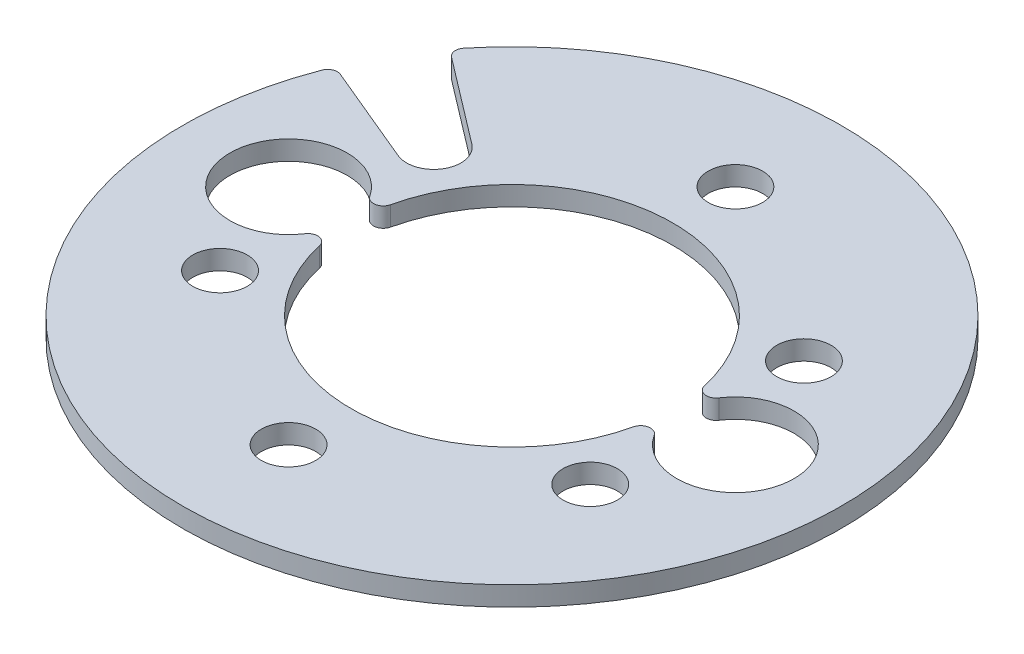
ISO-10303-21;
HEADER;
FILE_DESCRIPTION(('STEP AP214'),'2;1');
FILE_NAME('part.step','',(''),(''),'','','');
FILE_SCHEMA(('AUTOMOTIVE_DESIGN { 1 0 10303 214 1 1 1 1 }'));
ENDSEC;
DATA;
#1=APPLICATION_CONTEXT('core data for automotive mechanical design processes');
#2=APPLICATION_PROTOCOL_DEFINITION('international standard','automotive_design',2000,#1);
#3=PRODUCT_CONTEXT('',#1,'mechanical');
#4=PRODUCT('Part','Part','',(#3));
#5=PRODUCT_RELATED_PRODUCT_CATEGORY('part','',(#4));
#6=PRODUCT_DEFINITION_FORMATION('','',#4);
#7=PRODUCT_DEFINITION_CONTEXT('part definition',#1,'design');
#8=PRODUCT_DEFINITION('design','',#6,#7);
#9=PRODUCT_DEFINITION_SHAPE('','',#8);
#10=(LENGTH_UNIT() NAMED_UNIT(*) SI_UNIT(.MILLI.,.METRE.));
#11=(NAMED_UNIT(*) PLANE_ANGLE_UNIT() SI_UNIT($,.RADIAN.));
#12=(NAMED_UNIT(*) SI_UNIT($,.STERADIAN.) SOLID_ANGLE_UNIT());
#13=UNCERTAINTY_MEASURE_WITH_UNIT(LENGTH_MEASURE(1.E-05),#10,'distance_accuracy_value','');
#14=(GEOMETRIC_REPRESENTATION_CONTEXT(3) GLOBAL_UNCERTAINTY_ASSIGNED_CONTEXT((#13)) GLOBAL_UNIT_ASSIGNED_CONTEXT((#10,
#11,#12)) REPRESENTATION_CONTEXT('',''));
#15=CARTESIAN_POINT('',(0.,0.,0.));
#16=DIRECTION('',(0.,0.,1.));
#17=DIRECTION('',(1.,0.,0.));
#18=AXIS2_PLACEMENT_3D('',#15,#16,#17);
#19=CARTESIAN_POINT('',(-48.806600072886,3.175,-18.683566297026));
#20=DIRECTION('',(0.,-1.,0.));
#21=DIRECTION('',(0.,0.,-1.));
#22=AXIS2_PLACEMENT_3D('',#19,#20,#21);
#23=PLANE('',#22);
#24=CARTESIAN_POINT('',(-30.2459372271715,3.175,17.4625));
#25=DIRECTION('',(0.,1.,0.));
#26=DIRECTION('',(0.,0.,1.));
#27=AXIS2_PLACEMENT_3D('',#24,#25,#26);
#28=CIRCLE('',#27,4.44499999999999);
#29=CARTESIAN_POINT('',(-30.2459372271715,3.175,21.9075));
#30=VERTEX_POINT('',#29);
#31=EDGE_CURVE('E206',#30,#30,#28,.T.);
#32=ORIENTED_EDGE('',*,*,#31,.F.);
#33=EDGE_LOOP('',(#32));
#34=FACE_BOUND('',#33,.T.);
#35=CARTESIAN_POINT('',(30.2459372271715,3.175,-17.4625));
#36=DIRECTION('',(0.,1.,0.));
#37=DIRECTION('',(0.,0.,1.));
#38=AXIS2_PLACEMENT_3D('',#35,#36,#37);
#39=CIRCLE('',#38,4.44499999999999);
#40=CARTESIAN_POINT('',(30.2459372271715,3.175,-13.0175));
#41=VERTEX_POINT('',#40);
#42=EDGE_CURVE('E212',#41,#41,#39,.T.);
#43=ORIENTED_EDGE('',*,*,#42,.F.);
#44=EDGE_LOOP('',(#43));
#45=FACE_BOUND('',#44,.T.);
#46=CARTESIAN_POINT('',(0.,3.175,36.5125));
#47=DIRECTION('',(0.,1.,0.));
#48=DIRECTION('',(0.,0.,1.));
#49=AXIS2_PLACEMENT_3D('',#46,#47,#48);
#50=CIRCLE('',#49,4.445);
#51=CARTESIAN_POINT('',(0.,3.175,40.9575));
#52=VERTEX_POINT('',#51);
#53=EDGE_CURVE('E218',#52,#52,#50,.T.);
#54=ORIENTED_EDGE('',*,*,#53,.F.);
#55=EDGE_LOOP('',(#54));
#56=FACE_BOUND('',#55,.T.);
#57=CARTESIAN_POINT('',(0.,3.175,-36.5125));
#58=DIRECTION('',(0.,1.,0.));
#59=DIRECTION('',(0.,0.,1.));
#60=AXIS2_PLACEMENT_3D('',#57,#58,#59);
#61=CIRCLE('',#60,4.445);
#62=CARTESIAN_POINT('',(0.,3.175,-32.0675));
#63=VERTEX_POINT('',#62);
#64=EDGE_CURVE('E224',#63,#63,#61,.T.);
#65=ORIENTED_EDGE('',*,*,#64,.F.);
#66=EDGE_LOOP('',(#65));
#67=FACE_BOUND('',#66,.T.);
#68=CARTESIAN_POINT('',(-48.806600072886,3.175,-18.683566297026));
#69=DIRECTION('',(0.,1.,0.));
#70=DIRECTION('',(0.,0.,-1.));
#71=AXIS2_PLACEMENT_3D('',#68,#69,#70);
#72=CIRCLE('',#71,1.58749999999999);
#73=CARTESIAN_POINT('',(-48.1942815349155,3.175,-20.148224024298));
#74=VERTEX_POINT('',#73);
#75=CARTESIAN_POINT('',(-50.2891820921109,3.175,-19.2511108382479));
#76=VERTEX_POINT('',#75);
#77=EDGE_CURVE('E230',#74,#76,#72,.T.);
#78=ORIENTED_EDGE('',*,*,#77,.T.);
#79=CARTESIAN_POINT('',(0.,3.175,0.));
#80=DIRECTION('',(0.,1.,0.));
#81=DIRECTION('',(0.,0.,1.));
#82=AXIS2_PLACEMENT_3D('',#79,#80,#81);
#83=CIRCLE('',#82,53.848);
#84=CARTESIAN_POINT('',(-41.8165420830481,3.175,-33.9261538081856));
#85=VERTEX_POINT('',#84);
#86=EDGE_CURVE('E233',#76,#85,#83,.T.);
#87=ORIENTED_EDGE('',*,*,#86,.T.);
#88=CARTESIAN_POINT('',(-40.5837430829583,3.175,-32.9259723869537));
#89=DIRECTION('',(0.,1.,0.));
#90=DIRECTION('',(0.,0.,-1.));
#91=AXIS2_PLACEMENT_3D('',#88,#89,#90);
#92=CIRCLE('',#91,1.58749999999999);
#93=CARTESIAN_POINT('',(-41.5460146136398,3.175,-31.6633601142271));
#94=VERTEX_POINT('',#93);
#95=EDGE_CURVE('E236',#85,#94,#92,.T.);
#96=ORIENTED_EDGE('',*,*,#95,.T.);
#97=DIRECTION('',(0.795346313528562,0.,0.606155294917505));
#98=VECTOR('',#97,1.);
#99=CARTESIAN_POINT('',(-27.5515769412632,3.175,-20.9978143636344));
#100=LINE('',#99,#98);
#101=CARTESIAN_POINT('',(-27.5515769412632,3.175,-20.9978143636344));
#102=VERTEX_POINT('',#101);
#103=EDGE_CURVE('E238',#94,#102,#100,.T.);
#104=ORIENTED_EDGE('',*,*,#103,.T.);
#105=CARTESIAN_POINT('',(-30.2459372271715,3.175,-17.4625));
#106=DIRECTION('',(0.,-1.,0.));
#107=DIRECTION('',(0.,0.,1.));
#108=AXIS2_PLACEMENT_3D('',#105,#106,#107);
#109=CIRCLE('',#108,4.445);
#110=CARTESIAN_POINT('',(-31.9604291334888,3.175,-13.3614583636383));
#111=VERTEX_POINT('',#110);
#112=EDGE_CURVE('E240',#102,#111,#109,.T.);
#113=ORIENTED_EDGE('',*,*,#112,.T.);
#114=DIRECTION('',(-0.922619040801289,0.,-0.385712464863284));
#115=VECTOR('',#114,1.);
#116=CARTESIAN_POINT('',(-31.9604291334888,3.175,-13.3614583636382));
#117=LINE('',#116,#115);
#118=EDGE_CURVE('E242',#111,#74,#117,.T.);
#119=ORIENTED_EDGE('',*,*,#118,.T.);
#120=EDGE_LOOP('',(#78,#87,#96,#104,#113,#119));
#121=FACE_BOUND('',#120,.T.);
#122=CARTESIAN_POINT('',(27.1888443850543,3.175,-6.1535350210508));
#123=DIRECTION('',(0.,-1.,0.));
#124=DIRECTION('',(0.,0.,1.));
#125=AXIS2_PLACEMENT_3D('',#122,#123,#124);
#126=CIRCLE('',#125,1.5875);
#127=CARTESIAN_POINT('',(28.5137918932177,3.175,-5.27908070514192));
#128=VERTEX_POINT('',#127);
#129=CARTESIAN_POINT('',(25.6405047275911,3.175,-5.80310591962422));
#130=VERTEX_POINT('',#129);
#131=EDGE_CURVE('E138',#128,#130,#126,.T.);
#132=ORIENTED_EDGE('',*,*,#131,.F.);
#133=CARTESIAN_POINT('',(36.5125,3.175,0.));
#134=DIRECTION('',(0.,1.,0.));
#135=DIRECTION('',(0.,0.,1.));
#136=AXIS2_PLACEMENT_3D('',#133,#134,#135);
#137=CIRCLE('',#136,9.5837375);
#138=CARTESIAN_POINT('',(28.5137918932177,3.175,5.27908070514192));
#139=VERTEX_POINT('',#138);
#140=EDGE_CURVE('E173',#139,#128,#137,.T.);
#141=ORIENTED_EDGE('',*,*,#140,.F.);
#142=CARTESIAN_POINT('',(27.1888443850543,3.175,6.1535350210508));
#143=DIRECTION('',(0.,-1.,0.));
#144=DIRECTION('',(0.,0.,-1.));
#145=AXIS2_PLACEMENT_3D('',#142,#143,#144);
#146=CIRCLE('',#145,1.5875);
#147=CARTESIAN_POINT('',(25.6405047275911,3.175,5.80310591962421));
#148=VERTEX_POINT('',#147);
#149=EDGE_CURVE('E171',#148,#139,#146,.T.);
#150=ORIENTED_EDGE('',*,*,#149,.F.);
#151=CARTESIAN_POINT('',(0.,3.175,0.));
#152=DIRECTION('',(0.,1.,0.));
#153=DIRECTION('',(0.,0.,1.));
#154=AXIS2_PLACEMENT_3D('',#151,#152,#153);
#155=CIRCLE('',#154,26.289);
#156=CARTESIAN_POINT('',(-25.6405047275911,3.175,5.80310591962422));
#157=VERTEX_POINT('',#156);
#158=EDGE_CURVE('E169',#157,#148,#155,.T.);
#159=ORIENTED_EDGE('',*,*,#158,.F.);
#160=CARTESIAN_POINT('',(-27.1888443850543,3.175,6.1535350210508));
#161=DIRECTION('',(0.,-1.,0.));
#162=DIRECTION('',(0.,0.,-1.));
#163=AXIS2_PLACEMENT_3D('',#160,#161,#162);
#164=CIRCLE('',#163,1.5875);
#165=CARTESIAN_POINT('',(-28.5137918932177,3.175,5.27908070514192));
#166=VERTEX_POINT('',#165);
#167=EDGE_CURVE('E167',#166,#157,#164,.T.);
#168=ORIENTED_EDGE('',*,*,#167,.F.);
#169=CARTESIAN_POINT('',(-36.5125,3.175,0.));
#170=DIRECTION('',(0.,1.,0.));
#171=DIRECTION('',(0.,0.,1.));
#172=AXIS2_PLACEMENT_3D('',#169,#170,#171);
#173=CIRCLE('',#172,9.5837375);
#174=CARTESIAN_POINT('',(-28.5137918932177,3.175,-5.27908070514192));
#175=VERTEX_POINT('',#174);
#176=EDGE_CURVE('E162',#175,#166,#173,.T.);
#177=ORIENTED_EDGE('',*,*,#176,.F.);
#178=CARTESIAN_POINT('',(-27.1888443850543,3.175,-6.1535350210508));
#179=DIRECTION('',(0.,-1.,0.));
#180=DIRECTION('',(0.,0.,1.));
#181=AXIS2_PLACEMENT_3D('',#178,#179,#180);
#182=CIRCLE('',#181,1.5875);
#183=CARTESIAN_POINT('',(-25.6405047275911,3.175,-5.80310591962421));
#184=VERTEX_POINT('',#183);
#185=EDGE_CURVE('E160',#184,#175,#182,.T.);
#186=ORIENTED_EDGE('',*,*,#185,.F.);
#187=CARTESIAN_POINT('',(0.,3.175,0.));
#188=DIRECTION('',(0.,1.,0.));
#189=DIRECTION('',(0.,0.,1.));
#190=AXIS2_PLACEMENT_3D('',#187,#188,#189);
#191=CIRCLE('',#190,26.289);
#192=EDGE_CURVE('E146',#130,#184,#191,.T.);
#193=ORIENTED_EDGE('',*,*,#192,.F.);
#194=EDGE_LOOP('',(#132,#141,#150,#159,#168,#177,#186,#193));
#195=FACE_BOUND('',#194,.T.);
#196=CARTESIAN_POINT('',(30.2459372271715,3.175,17.4625));
#197=DIRECTION('',(0.,1.,0.));
#198=DIRECTION('',(0.,0.,1.));
#199=AXIS2_PLACEMENT_3D('',#196,#197,#198);
#200=CIRCLE('',#199,4.445);
#201=CARTESIAN_POINT('',(30.2459372271715,3.175,21.9075));
#202=VERTEX_POINT('',#201);
#203=EDGE_CURVE('E176',#202,#202,#200,.T.);
#204=ORIENTED_EDGE('',*,*,#203,.F.);
#205=EDGE_LOOP('',(#204));
#206=FACE_BOUND('',#205,.T.);
#207=ADVANCED_FACE('F37',(#34,#45,#56,#67,#121,#195,#206),#23,.F.);
#208=CARTESIAN_POINT('',(-48.806600072886,0.,-18.683566297026));
#209=DIRECTION('',(0.,-1.,0.));
#210=DIRECTION('',(0.,0.,-1.));
#211=AXIS2_PLACEMENT_3D('',#208,#209,#210);
#212=PLANE('',#211);
#213=CARTESIAN_POINT('',(36.5125,0.,0.));
#214=DIRECTION('',(0.,1.,0.));
#215=DIRECTION('',(0.,0.,1.));
#216=AXIS2_PLACEMENT_3D('',#213,#214,#215);
#217=CIRCLE('',#216,9.5837375);
#218=CARTESIAN_POINT('',(28.5137918932177,0.,5.27908070514192));
#219=VERTEX_POINT('',#218);
#220=CARTESIAN_POINT('',(28.5137918932177,0.,-5.27908070514192));
#221=VERTEX_POINT('',#220);
#222=EDGE_CURVE('E147',#219,#221,#217,.T.);
#223=ORIENTED_EDGE('',*,*,#222,.T.);
#224=CARTESIAN_POINT('',(27.1888443850543,0.,-6.1535350210508));
#225=DIRECTION('',(0.,-1.,0.));
#226=DIRECTION('',(0.,0.,1.));
#227=AXIS2_PLACEMENT_3D('',#224,#225,#226);
#228=CIRCLE('',#227,1.5875);
#229=CARTESIAN_POINT('',(25.6405047275911,0.,-5.80310591962422));
#230=VERTEX_POINT('',#229);
#231=EDGE_CURVE('E60',#221,#230,#228,.T.);
#232=ORIENTED_EDGE('',*,*,#231,.T.);
#233=CARTESIAN_POINT('',(0.,0.,0.));
#234=DIRECTION('',(0.,1.,0.));
#235=DIRECTION('',(0.,0.,1.));
#236=AXIS2_PLACEMENT_3D('',#233,#234,#235);
#237=CIRCLE('',#236,26.289);
#238=CARTESIAN_POINT('',(-25.6405047275911,0.,-5.80310591962421));
#239=VERTEX_POINT('',#238);
#240=EDGE_CURVE('E153',#230,#239,#237,.T.);
#241=ORIENTED_EDGE('',*,*,#240,.T.);
#242=CARTESIAN_POINT('',(-27.1888443850543,0.,-6.1535350210508));
#243=DIRECTION('',(0.,-1.,0.));
#244=DIRECTION('',(0.,0.,1.));
#245=AXIS2_PLACEMENT_3D('',#242,#243,#244);
#246=CIRCLE('',#245,1.5875);
#247=CARTESIAN_POINT('',(-28.5137918932177,0.,-5.27908070514192));
#248=VERTEX_POINT('',#247);
#249=EDGE_CURVE('E178',#239,#248,#246,.T.);
#250=ORIENTED_EDGE('',*,*,#249,.T.);
#251=CARTESIAN_POINT('',(-36.5125,0.,0.));
#252=DIRECTION('',(0.,1.,0.));
#253=DIRECTION('',(0.,0.,1.));
#254=AXIS2_PLACEMENT_3D('',#251,#252,#253);
#255=CIRCLE('',#254,9.5837375);
#256=CARTESIAN_POINT('',(-28.5137918932177,0.,5.27908070514192));
#257=VERTEX_POINT('',#256);
#258=EDGE_CURVE('E181',#248,#257,#255,.T.);
#259=ORIENTED_EDGE('',*,*,#258,.T.);
#260=CARTESIAN_POINT('',(-27.1888443850543,0.,6.1535350210508));
#261=DIRECTION('',(0.,-1.,0.));
#262=DIRECTION('',(0.,0.,-1.));
#263=AXIS2_PLACEMENT_3D('',#260,#261,#262);
#264=CIRCLE('',#263,1.5875);
#265=CARTESIAN_POINT('',(-25.6405047275911,0.,5.80310591962422));
#266=VERTEX_POINT('',#265);
#267=EDGE_CURVE('E184',#257,#266,#264,.T.);
#268=ORIENTED_EDGE('',*,*,#267,.T.);
#269=CARTESIAN_POINT('',(0.,0.,0.));
#270=DIRECTION('',(0.,1.,0.));
#271=DIRECTION('',(0.,0.,1.));
#272=AXIS2_PLACEMENT_3D('',#269,#270,#271);
#273=CIRCLE('',#272,26.289);
#274=CARTESIAN_POINT('',(25.6405047275911,0.,5.80310591962421));
#275=VERTEX_POINT('',#274);
#276=EDGE_CURVE('E187',#266,#275,#273,.T.);
#277=ORIENTED_EDGE('',*,*,#276,.T.);
#278=CARTESIAN_POINT('',(27.1888443850543,0.,6.1535350210508));
#279=DIRECTION('',(0.,-1.,0.));
#280=DIRECTION('',(0.,0.,-1.));
#281=AXIS2_PLACEMENT_3D('',#278,#279,#280);
#282=CIRCLE('',#281,1.5875);
#283=EDGE_CURVE('E190',#275,#219,#282,.T.);
#284=ORIENTED_EDGE('',*,*,#283,.T.);
#285=EDGE_LOOP('',(#223,#232,#241,#250,#259,#268,#277,#284));
#286=FACE_BOUND('',#285,.T.);
#287=CARTESIAN_POINT('',(-30.2459372271715,0.,17.4625));
#288=DIRECTION('',(0.,1.,0.));
#289=DIRECTION('',(0.,0.,1.));
#290=AXIS2_PLACEMENT_3D('',#287,#288,#289);
#291=CIRCLE('',#290,4.44499999999999);
#292=CARTESIAN_POINT('',(-30.2459372271715,0.,21.9075));
#293=VERTEX_POINT('',#292);
#294=EDGE_CURVE('E154',#293,#293,#291,.T.);
#295=ORIENTED_EDGE('',*,*,#294,.T.);
#296=EDGE_LOOP('',(#295));
#297=FACE_BOUND('',#296,.T.);
#298=CARTESIAN_POINT('',(0.,0.,36.5125));
#299=DIRECTION('',(0.,1.,0.));
#300=DIRECTION('',(0.,0.,1.));
#301=AXIS2_PLACEMENT_3D('',#298,#299,#300);
#302=CIRCLE('',#301,4.445);
#303=CARTESIAN_POINT('',(0.,0.,40.9575));
#304=VERTEX_POINT('',#303);
#305=EDGE_CURVE('E215',#304,#304,#302,.T.);
#306=ORIENTED_EDGE('',*,*,#305,.T.);
#307=EDGE_LOOP('',(#306));
#308=FACE_BOUND('',#307,.T.);
#309=CARTESIAN_POINT('',(-48.806600072886,0.,-18.683566297026));
#310=DIRECTION('',(0.,1.,0.));
#311=DIRECTION('',(0.,0.,-1.));
#312=AXIS2_PLACEMENT_3D('',#309,#310,#311);
#313=CIRCLE('',#312,1.58749999999999);
#314=CARTESIAN_POINT('',(-48.1942815349155,0.,-20.148224024298));
#315=VERTEX_POINT('',#314);
#316=CARTESIAN_POINT('',(-50.2891820921109,0.,-19.2511108382479));
#317=VERTEX_POINT('',#316);
#318=EDGE_CURVE('E227',#315,#317,#313,.T.);
#319=ORIENTED_EDGE('',*,*,#318,.F.);
#320=DIRECTION('',(-0.922619040801289,0.,-0.385712464863284));
#321=VECTOR('',#320,1.);
#322=CARTESIAN_POINT('',(-31.9604291334888,0.,-13.3614583636382));
#323=LINE('',#322,#321);
#324=CARTESIAN_POINT('',(-31.9604291334888,0.,-13.3614583636383));
#325=VERTEX_POINT('',#324);
#326=EDGE_CURVE('E234',#325,#315,#323,.T.);
#327=ORIENTED_EDGE('',*,*,#326,.F.);
#328=CARTESIAN_POINT('',(-30.2459372271715,0.,-17.4625));
#329=DIRECTION('',(0.,-1.,0.));
#330=DIRECTION('',(0.,0.,1.));
#331=AXIS2_PLACEMENT_3D('',#328,#329,#330);
#332=CIRCLE('',#331,4.445);
#333=CARTESIAN_POINT('',(-27.5515769412632,0.,-20.9978143636344));
#334=VERTEX_POINT('',#333);
#335=EDGE_CURVE('E253',#334,#325,#332,.T.);
#336=ORIENTED_EDGE('',*,*,#335,.F.);
#337=DIRECTION('',(0.795346313528562,0.,0.606155294917505));
#338=VECTOR('',#337,1.);
#339=CARTESIAN_POINT('',(-27.5515769412632,0.,-20.9978143636344));
#340=LINE('',#339,#338);
#341=CARTESIAN_POINT('',(-41.5460146136398,0.,-31.6633601142271));
#342=VERTEX_POINT('',#341);
#343=EDGE_CURVE('E251',#342,#334,#340,.T.);
#344=ORIENTED_EDGE('',*,*,#343,.F.);
#345=CARTESIAN_POINT('',(-40.5837430829583,0.,-32.9259723869537));
#346=DIRECTION('',(0.,1.,0.));
#347=DIRECTION('',(0.,0.,-1.));
#348=AXIS2_PLACEMENT_3D('',#345,#346,#347);
#349=CIRCLE('',#348,1.58749999999999);
#350=CARTESIAN_POINT('',(-41.8165420830481,0.,-33.9261538081856));
#351=VERTEX_POINT('',#350);
#352=EDGE_CURVE('E249',#351,#342,#349,.T.);
#353=ORIENTED_EDGE('',*,*,#352,.F.);
#354=CARTESIAN_POINT('',(0.,0.,0.));
#355=DIRECTION('',(0.,1.,0.));
#356=DIRECTION('',(0.,0.,1.));
#357=AXIS2_PLACEMENT_3D('',#354,#355,#356);
#358=CIRCLE('',#357,53.848);
#359=EDGE_CURVE('E247',#317,#351,#358,.T.);
#360=ORIENTED_EDGE('',*,*,#359,.F.);
#361=EDGE_LOOP('',(#319,#327,#336,#344,#353,#360));
#362=FACE_BOUND('',#361,.T.);
#363=CARTESIAN_POINT('',(0.,0.,-36.5125));
#364=DIRECTION('',(0.,1.,0.));
#365=DIRECTION('',(0.,0.,1.));
#366=AXIS2_PLACEMENT_3D('',#363,#364,#365);
#367=CIRCLE('',#366,4.445);
#368=CARTESIAN_POINT('',(0.,0.,-32.0675));
#369=VERTEX_POINT('',#368);
#370=EDGE_CURVE('E221',#369,#369,#367,.T.);
#371=ORIENTED_EDGE('',*,*,#370,.T.);
#372=EDGE_LOOP('',(#371));
#373=FACE_BOUND('',#372,.T.);
#374=CARTESIAN_POINT('',(30.2459372271715,0.,-17.4625));
#375=DIRECTION('',(0.,1.,0.));
#376=DIRECTION('',(0.,0.,1.));
#377=AXIS2_PLACEMENT_3D('',#374,#375,#376);
#378=CIRCLE('',#377,4.44499999999999);
#379=CARTESIAN_POINT('',(30.2459372271715,0.,-13.0175));
#380=VERTEX_POINT('',#379);
#381=EDGE_CURVE('E209',#380,#380,#378,.T.);
#382=ORIENTED_EDGE('',*,*,#381,.T.);
#383=EDGE_LOOP('',(#382));
#384=FACE_BOUND('',#383,.T.);
#385=CARTESIAN_POINT('',(30.2459372271715,0.,17.4625));
#386=DIRECTION('',(0.,1.,0.));
#387=DIRECTION('',(0.,0.,1.));
#388=AXIS2_PLACEMENT_3D('',#385,#386,#387);
#389=CIRCLE('',#388,4.445);
#390=CARTESIAN_POINT('',(30.2459372271715,0.,21.9075));
#391=VERTEX_POINT('',#390);
#392=EDGE_CURVE('E368',#391,#391,#389,.T.);
#393=ORIENTED_EDGE('',*,*,#392,.T.);
#394=EDGE_LOOP('',(#393));
#395=FACE_BOUND('',#394,.T.);
#396=ADVANCED_FACE('F277',(#286,#297,#308,#362,#373,#384,#395),#212,.T.);
#397=CARTESIAN_POINT('',(-48.806600072886,3.175,-18.683566297026));
#398=DIRECTION('',(0.,-1.,0.));
#399=DIRECTION('',(0.,0.,-1.));
#400=AXIS2_PLACEMENT_3D('',#397,#398,#399);
#401=CYLINDRICAL_SURFACE('',#400,1.58749999999999);
#402=ORIENTED_EDGE('',*,*,#318,.T.);
#403=DIRECTION('',(0.,-1.,0.));
#404=VECTOR('',#403,1.);
#405=CARTESIAN_POINT('',(-50.2891820921109,3.175,-19.2511108382479));
#406=LINE('',#405,#404);
#407=EDGE_CURVE('E11',#76,#317,#406,.T.);
#408=ORIENTED_EDGE('',*,*,#407,.F.);
#409=ORIENTED_EDGE('',*,*,#77,.F.);
#410=DIRECTION('',(0.,-1.,0.));
#411=VECTOR('',#410,1.);
#412=CARTESIAN_POINT('',(-48.1942815349155,3.175,-20.148224024298));
#413=LINE('',#412,#411);
#414=EDGE_CURVE('E244',#74,#315,#413,.T.);
#415=ORIENTED_EDGE('',*,*,#414,.T.);
#416=EDGE_LOOP('',(#402,#408,#409,#415));
#417=FACE_BOUND('',#416,.T.);
#418=ADVANCED_FACE('F39',(#417),#401,.T.);
#419=CARTESIAN_POINT('',(0.,3.175,0.));
#420=DIRECTION('',(0.,-1.,0.));
#421=DIRECTION('',(0.,0.,-1.));
#422=AXIS2_PLACEMENT_3D('',#419,#420,#421);
#423=CYLINDRICAL_SURFACE('',#422,53.848);
#424=ORIENTED_EDGE('',*,*,#359,.T.);
#425=DIRECTION('',(0.,-1.,0.));
#426=VECTOR('',#425,1.);
#427=CARTESIAN_POINT('',(-41.8165420830481,3.175,-33.9261538081856));
#428=LINE('',#427,#426);
#429=EDGE_CURVE('E45',#85,#351,#428,.T.);
#430=ORIENTED_EDGE('',*,*,#429,.F.);
#431=ORIENTED_EDGE('',*,*,#86,.F.);
#432=ORIENTED_EDGE('',*,*,#407,.T.);
#433=EDGE_LOOP('',(#424,#430,#431,#432));
#434=FACE_BOUND('',#433,.T.);
#435=ADVANCED_FACE('F294',(#434),#423,.T.);
#436=CARTESIAN_POINT('',(-40.5837430829583,3.175,-32.9259723869537));
#437=DIRECTION('',(0.,-1.,0.));
#438=DIRECTION('',(0.,0.,-1.));
#439=AXIS2_PLACEMENT_3D('',#436,#437,#438);
#440=CYLINDRICAL_SURFACE('',#439,1.58749999999999);
#441=ORIENTED_EDGE('',*,*,#352,.T.);
#442=DIRECTION('',(0.,-1.,0.));
#443=VECTOR('',#442,1.);
#444=CARTESIAN_POINT('',(-41.5460146136398,3.175,-31.6633601142271));
#445=LINE('',#444,#443);
#446=EDGE_CURVE('E264',#94,#342,#445,.T.);
#447=ORIENTED_EDGE('',*,*,#446,.F.);
#448=ORIENTED_EDGE('',*,*,#95,.F.);
#449=ORIENTED_EDGE('',*,*,#429,.T.);
#450=EDGE_LOOP('',(#441,#447,#448,#449));
#451=FACE_BOUND('',#450,.T.);
#452=ADVANCED_FACE('F271',(#451),#440,.T.);
#453=CARTESIAN_POINT('',(-27.5515769412632,3.175,-20.9978143636344));
#454=DIRECTION('',(0.606155294917505,0.,-0.795346313528562));
#455=DIRECTION('',(-0.795346313528562,0.,-0.606155294917505));
#456=AXIS2_PLACEMENT_3D('',#453,#454,#455);
#457=PLANE('',#456);
#458=ORIENTED_EDGE('',*,*,#343,.T.);
#459=DIRECTION('',(0.,-1.,0.));
#460=VECTOR('',#459,1.);
#461=CARTESIAN_POINT('',(-27.5515769412632,3.175,-20.9978143636344));
#462=LINE('',#461,#460);
#463=EDGE_CURVE('E261',#102,#334,#462,.T.);
#464=ORIENTED_EDGE('',*,*,#463,.F.);
#465=ORIENTED_EDGE('',*,*,#103,.F.);
#466=ORIENTED_EDGE('',*,*,#446,.T.);
#467=EDGE_LOOP('',(#458,#464,#465,#466));
#468=FACE_BOUND('',#467,.T.);
#469=ADVANCED_FACE('F283',(#468),#457,.F.);
#470=CARTESIAN_POINT('',(-30.2459372271715,3.175,-17.4625));
#471=DIRECTION('',(0.,-1.,0.));
#472=DIRECTION('',(0.,0.,-1.));
#473=AXIS2_PLACEMENT_3D('',#470,#471,#472);
#474=CYLINDRICAL_SURFACE('',#473,4.445);
#475=ORIENTED_EDGE('',*,*,#335,.T.);
#476=DIRECTION('',(0.,-1.,0.));
#477=VECTOR('',#476,1.);
#478=CARTESIAN_POINT('',(-31.9604291334888,3.175,-13.3614583636383));
#479=LINE('',#478,#477);
#480=EDGE_CURVE('E258',#111,#325,#479,.T.);
#481=ORIENTED_EDGE('',*,*,#480,.F.);
#482=ORIENTED_EDGE('',*,*,#112,.F.);
#483=ORIENTED_EDGE('',*,*,#463,.T.);
#484=EDGE_LOOP('',(#475,#481,#482,#483));
#485=FACE_BOUND('',#484,.T.);
#486=ADVANCED_FACE('F287',(#485),#474,.F.);
#487=CARTESIAN_POINT('',(-31.9604291334888,3.175,-13.3614583636382));
#488=DIRECTION('',(-0.385712464863284,0.,0.922619040801289));
#489=DIRECTION('',(0.922619040801289,0.,0.385712464863284));
#490=AXIS2_PLACEMENT_3D('',#487,#488,#489);
#491=PLANE('',#490);
#492=ORIENTED_EDGE('',*,*,#326,.T.);
#493=ORIENTED_EDGE('',*,*,#414,.F.);
#494=ORIENTED_EDGE('',*,*,#118,.F.);
#495=ORIENTED_EDGE('',*,*,#480,.T.);
#496=EDGE_LOOP('',(#492,#493,#494,#495));
#497=FACE_BOUND('',#496,.T.);
#498=ADVANCED_FACE('F297',(#497),#491,.F.);
#499=CARTESIAN_POINT('',(0.,3.175,-36.5125));
#500=DIRECTION('',(0.,-1.,0.));
#501=DIRECTION('',(0.,0.,-1.));
#502=AXIS2_PLACEMENT_3D('',#499,#500,#501);
#503=CYLINDRICAL_SURFACE('',#502,4.445);
#504=ORIENTED_EDGE('',*,*,#64,.T.);
#505=EDGE_LOOP('',(#504));
#506=FACE_BOUND('',#505,.T.);
#507=ORIENTED_EDGE('',*,*,#370,.F.);
#508=EDGE_LOOP('',(#507));
#509=FACE_BOUND('',#508,.T.);
#510=ADVANCED_FACE('F299',(#506,#509),#503,.F.);
#511=CARTESIAN_POINT('',(0.,3.175,36.5125));
#512=DIRECTION('',(0.,-1.,0.));
#513=DIRECTION('',(0.,0.,-1.));
#514=AXIS2_PLACEMENT_3D('',#511,#512,#513);
#515=CYLINDRICAL_SURFACE('',#514,4.445);
#516=ORIENTED_EDGE('',*,*,#53,.T.);
#517=EDGE_LOOP('',(#516));
#518=FACE_BOUND('',#517,.T.);
#519=ORIENTED_EDGE('',*,*,#305,.F.);
#520=EDGE_LOOP('',(#519));
#521=FACE_BOUND('',#520,.T.);
#522=ADVANCED_FACE('F305',(#518,#521),#515,.F.);
#523=CARTESIAN_POINT('',(30.2459372271715,3.175,-17.4625));
#524=DIRECTION('',(0.,-1.,0.));
#525=DIRECTION('',(0.,0.,-1.));
#526=AXIS2_PLACEMENT_3D('',#523,#524,#525);
#527=CYLINDRICAL_SURFACE('',#526,4.44499999999999);
#528=ORIENTED_EDGE('',*,*,#42,.T.);
#529=EDGE_LOOP('',(#528));
#530=FACE_BOUND('',#529,.T.);
#531=ORIENTED_EDGE('',*,*,#381,.F.);
#532=EDGE_LOOP('',(#531));
#533=FACE_BOUND('',#532,.T.);
#534=ADVANCED_FACE('F322',(#530,#533),#527,.F.);
#535=CARTESIAN_POINT('',(-30.2459372271715,3.175,17.4625));
#536=DIRECTION('',(0.,-1.,0.));
#537=DIRECTION('',(0.,0.,-1.));
#538=AXIS2_PLACEMENT_3D('',#535,#536,#537);
#539=CYLINDRICAL_SURFACE('',#538,4.44499999999999);
#540=ORIENTED_EDGE('',*,*,#31,.T.);
#541=EDGE_LOOP('',(#540));
#542=FACE_BOUND('',#541,.T.);
#543=ORIENTED_EDGE('',*,*,#294,.F.);
#544=EDGE_LOOP('',(#543));
#545=FACE_BOUND('',#544,.T.);
#546=ADVANCED_FACE('F326',(#542,#545),#539,.F.);
#547=CARTESIAN_POINT('',(27.1888443850543,3.175,-6.1535350210508));
#548=DIRECTION('',(0.,-1.,0.));
#549=DIRECTION('',(0.,0.,-1.));
#550=AXIS2_PLACEMENT_3D('',#547,#548,#549);
#551=CYLINDRICAL_SURFACE('',#550,1.5875);
#552=ORIENTED_EDGE('',*,*,#231,.F.);
#553=DIRECTION('',(0.,-1.,0.));
#554=VECTOR('',#553,1.);
#555=CARTESIAN_POINT('',(28.5137918932177,3.175,-5.27908070514192));
#556=LINE('',#555,#554);
#557=EDGE_CURVE('E142',#128,#221,#556,.T.);
#558=ORIENTED_EDGE('',*,*,#557,.F.);
#559=ORIENTED_EDGE('',*,*,#131,.T.);
#560=DIRECTION('',(0.,-1.,0.));
#561=VECTOR('',#560,1.);
#562=CARTESIAN_POINT('',(25.6405047275911,3.175,-5.80310591962422));
#563=LINE('',#562,#561);
#564=EDGE_CURVE('E141',#130,#230,#563,.T.);
#565=ORIENTED_EDGE('',*,*,#564,.T.);
#566=EDGE_LOOP('',(#552,#558,#559,#565));
#567=FACE_BOUND('',#566,.T.);
#568=ADVANCED_FACE('F140',(#567),#551,.T.);
#569=CARTESIAN_POINT('',(0.,3.175,0.));
#570=DIRECTION('',(0.,-1.,0.));
#571=DIRECTION('',(0.,0.,-1.));
#572=AXIS2_PLACEMENT_3D('',#569,#570,#571);
#573=CYLINDRICAL_SURFACE('',#572,26.289);
#574=ORIENTED_EDGE('',*,*,#240,.F.);
#575=ORIENTED_EDGE('',*,*,#564,.F.);
#576=ORIENTED_EDGE('',*,*,#192,.T.);
#577=DIRECTION('',(0.,-1.,0.));
#578=VECTOR('',#577,1.);
#579=CARTESIAN_POINT('',(-25.6405047275911,3.175,-5.80310591962421));
#580=LINE('',#579,#578);
#581=EDGE_CURVE('E155',#184,#239,#580,.T.);
#582=ORIENTED_EDGE('',*,*,#581,.T.);
#583=EDGE_LOOP('',(#574,#575,#576,#582));
#584=FACE_BOUND('',#583,.T.);
#585=ADVANCED_FACE('F150',(#584),#573,.F.);
#586=CARTESIAN_POINT('',(-27.1888443850543,3.175,-6.1535350210508));
#587=DIRECTION('',(0.,-1.,0.));
#588=DIRECTION('',(0.,0.,-1.));
#589=AXIS2_PLACEMENT_3D('',#586,#587,#588);
#590=CYLINDRICAL_SURFACE('',#589,1.5875);
#591=ORIENTED_EDGE('',*,*,#249,.F.);
#592=ORIENTED_EDGE('',*,*,#581,.F.);
#593=ORIENTED_EDGE('',*,*,#185,.T.);
#594=DIRECTION('',(0.,-1.,0.));
#595=VECTOR('',#594,1.);
#596=CARTESIAN_POINT('',(-28.5137918932177,3.175,-5.27908070514192));
#597=LINE('',#596,#595);
#598=EDGE_CURVE('E203',#175,#248,#597,.T.);
#599=ORIENTED_EDGE('',*,*,#598,.T.);
#600=EDGE_LOOP('',(#591,#592,#593,#599));
#601=FACE_BOUND('',#600,.T.);
#602=ADVANCED_FACE('F335',(#601),#590,.T.);
#603=CARTESIAN_POINT('',(-36.5125,3.175,0.));
#604=DIRECTION('',(0.,-1.,0.));
#605=DIRECTION('',(0.,0.,-1.));
#606=AXIS2_PLACEMENT_3D('',#603,#604,#605);
#607=CYLINDRICAL_SURFACE('',#606,9.5837375);
#608=ORIENTED_EDGE('',*,*,#258,.F.);
#609=ORIENTED_EDGE('',*,*,#598,.F.);
#610=ORIENTED_EDGE('',*,*,#176,.T.);
#611=DIRECTION('',(0.,-1.,0.));
#612=VECTOR('',#611,1.);
#613=CARTESIAN_POINT('',(-28.5137918932177,3.175,5.27908070514192));
#614=LINE('',#613,#612);
#615=EDGE_CURVE('E201',#166,#257,#614,.T.);
#616=ORIENTED_EDGE('',*,*,#615,.T.);
#617=EDGE_LOOP('',(#608,#609,#610,#616));
#618=FACE_BOUND('',#617,.T.);
#619=ADVANCED_FACE('F338',(#618),#607,.F.);
#620=CARTESIAN_POINT('',(-27.1888443850543,3.175,6.1535350210508));
#621=DIRECTION('',(0.,-1.,0.));
#622=DIRECTION('',(0.,0.,-1.));
#623=AXIS2_PLACEMENT_3D('',#620,#621,#622);
#624=CYLINDRICAL_SURFACE('',#623,1.5875);
#625=ORIENTED_EDGE('',*,*,#267,.F.);
#626=ORIENTED_EDGE('',*,*,#615,.F.);
#627=ORIENTED_EDGE('',*,*,#167,.T.);
#628=DIRECTION('',(0.,-1.,0.));
#629=VECTOR('',#628,1.);
#630=CARTESIAN_POINT('',(-25.6405047275911,3.175,5.80310591962422));
#631=LINE('',#630,#629);
#632=EDGE_CURVE('E199',#157,#266,#631,.T.);
#633=ORIENTED_EDGE('',*,*,#632,.T.);
#634=EDGE_LOOP('',(#625,#626,#627,#633));
#635=FACE_BOUND('',#634,.T.);
#636=ADVANCED_FACE('F342',(#635),#624,.T.);
#637=CARTESIAN_POINT('',(0.,3.175,0.));
#638=DIRECTION('',(0.,-1.,0.));
#639=DIRECTION('',(0.,0.,-1.));
#640=AXIS2_PLACEMENT_3D('',#637,#638,#639);
#641=CYLINDRICAL_SURFACE('',#640,26.289);
#642=ORIENTED_EDGE('',*,*,#276,.F.);
#643=ORIENTED_EDGE('',*,*,#632,.F.);
#644=ORIENTED_EDGE('',*,*,#158,.T.);
#645=DIRECTION('',(0.,-1.,0.));
#646=VECTOR('',#645,1.);
#647=CARTESIAN_POINT('',(25.6405047275911,3.175,5.80310591962421));
#648=LINE('',#647,#646);
#649=EDGE_CURVE('E197',#148,#275,#648,.T.);
#650=ORIENTED_EDGE('',*,*,#649,.T.);
#651=EDGE_LOOP('',(#642,#643,#644,#650));
#652=FACE_BOUND('',#651,.T.);
#653=ADVANCED_FACE('F346',(#652),#641,.F.);
#654=CARTESIAN_POINT('',(27.1888443850543,3.175,6.1535350210508));
#655=DIRECTION('',(0.,-1.,0.));
#656=DIRECTION('',(0.,0.,-1.));
#657=AXIS2_PLACEMENT_3D('',#654,#655,#656);
#658=CYLINDRICAL_SURFACE('',#657,1.5875);
#659=ORIENTED_EDGE('',*,*,#283,.F.);
#660=ORIENTED_EDGE('',*,*,#649,.F.);
#661=ORIENTED_EDGE('',*,*,#149,.T.);
#662=DIRECTION('',(0.,-1.,0.));
#663=VECTOR('',#662,1.);
#664=CARTESIAN_POINT('',(28.5137918932177,3.175,5.27908070514192));
#665=LINE('',#664,#663);
#666=EDGE_CURVE('E52',#139,#219,#665,.T.);
#667=ORIENTED_EDGE('',*,*,#666,.T.);
#668=EDGE_LOOP('',(#659,#660,#661,#667));
#669=FACE_BOUND('',#668,.T.);
#670=ADVANCED_FACE('F350',(#669),#658,.T.);
#671=CARTESIAN_POINT('',(36.5125,3.175,0.));
#672=DIRECTION('',(0.,-1.,0.));
#673=DIRECTION('',(0.,0.,-1.));
#674=AXIS2_PLACEMENT_3D('',#671,#672,#673);
#675=CYLINDRICAL_SURFACE('',#674,9.5837375);
#676=ORIENTED_EDGE('',*,*,#222,.F.);
#677=ORIENTED_EDGE('',*,*,#666,.F.);
#678=ORIENTED_EDGE('',*,*,#140,.T.);
#679=ORIENTED_EDGE('',*,*,#557,.T.);
#680=EDGE_LOOP('',(#676,#677,#678,#679));
#681=FACE_BOUND('',#680,.T.);
#682=ADVANCED_FACE('F354',(#681),#675,.F.);
#683=CARTESIAN_POINT('',(30.2459372271715,3.175,17.4625));
#684=DIRECTION('',(0.,-1.,0.));
#685=DIRECTION('',(0.,0.,-1.));
#686=AXIS2_PLACEMENT_3D('',#683,#684,#685);
#687=CYLINDRICAL_SURFACE('',#686,4.445);
#688=ORIENTED_EDGE('',*,*,#203,.T.);
#689=EDGE_LOOP('',(#688));
#690=FACE_BOUND('',#689,.T.);
#691=ORIENTED_EDGE('',*,*,#392,.F.);
#692=EDGE_LOOP('',(#691));
#693=FACE_BOUND('',#692,.T.);
#694=ADVANCED_FACE('F358',(#690,#693),#687,.F.);
#695=CLOSED_SHELL('',(#207,#396,#418,#435,#452,#469,#486,#498,#510,#522,#534,#546,#568,#585,
#602,#619,#636,#653,#670,#682,#694));
#696=MANIFOLD_SOLID_BREP('B2',#695);
#697=ADVANCED_BREP_SHAPE_REPRESENTATION('',(#18,#696),#14);
#698=SHAPE_DEFINITION_REPRESENTATION(#9,#697);
ENDSEC;
END-ISO-10303-21;
